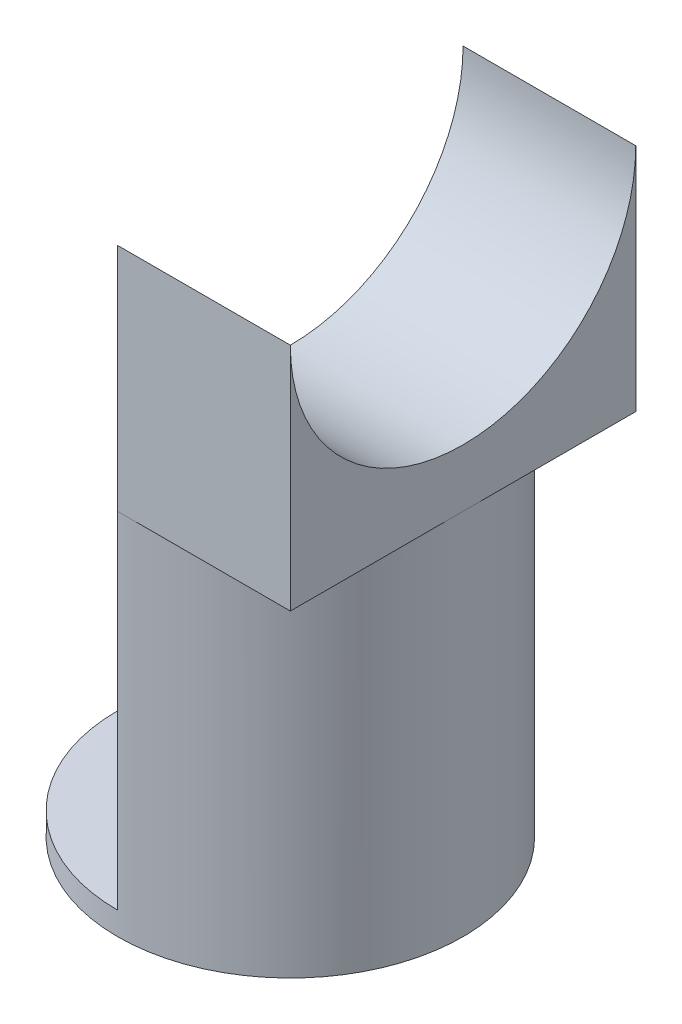
ISO-10303-21;
HEADER;
FILE_DESCRIPTION(('STEP AP214'),'2;1');
FILE_NAME('part.step','',(''),(''),'','','');
FILE_SCHEMA(('AUTOMOTIVE_DESIGN { 1 0 10303 214 1 1 1 1 }'));
ENDSEC;
DATA;
#1=APPLICATION_CONTEXT('core data for automotive mechanical design processes');
#2=APPLICATION_PROTOCOL_DEFINITION('international standard','automotive_design',2000,#1);
#3=PRODUCT_CONTEXT('',#1,'mechanical');
#4=PRODUCT('Part','Part','',(#3));
#5=PRODUCT_RELATED_PRODUCT_CATEGORY('part','',(#4));
#6=PRODUCT_DEFINITION_FORMATION('','',#4);
#7=PRODUCT_DEFINITION_CONTEXT('part definition',#1,'design');
#8=PRODUCT_DEFINITION('design','',#6,#7);
#9=PRODUCT_DEFINITION_SHAPE('','',#8);
#10=(LENGTH_UNIT() NAMED_UNIT(*) SI_UNIT(.MILLI.,.METRE.));
#11=(NAMED_UNIT(*) PLANE_ANGLE_UNIT() SI_UNIT($,.RADIAN.));
#12=(NAMED_UNIT(*) SI_UNIT($,.STERADIAN.) SOLID_ANGLE_UNIT());
#13=UNCERTAINTY_MEASURE_WITH_UNIT(LENGTH_MEASURE(1.E-05),#10,'distance_accuracy_value','');
#14=(GEOMETRIC_REPRESENTATION_CONTEXT(3) GLOBAL_UNCERTAINTY_ASSIGNED_CONTEXT((#13)) GLOBAL_UNIT_ASSIGNED_CONTEXT((#10,
#11,#12)) REPRESENTATION_CONTEXT('',''));
#15=CARTESIAN_POINT('',(0.,0.,0.));
#16=DIRECTION('',(0.,0.,1.));
#17=DIRECTION('',(1.,0.,0.));
#18=AXIS2_PLACEMENT_3D('',#15,#16,#17);
#19=CARTESIAN_POINT('',(0.,10.,0.));
#20=DIRECTION('',(0.,-1.,0.));
#21=DIRECTION('',(0.,0.,-1.));
#22=AXIS2_PLACEMENT_3D('',#19,#20,#21);
#23=CYLINDRICAL_SURFACE('',#22,75.);
#24=CARTESIAN_POINT('',(0.,10.,0.));
#25=DIRECTION('',(0.,1.,0.));
#26=DIRECTION('',(0.,0.,1.));
#27=AXIS2_PLACEMENT_3D('',#24,#25,#26);
#28=CIRCLE('',#27,75.);
#29=CARTESIAN_POINT('',(0.,10.,-75.));
#30=VERTEX_POINT('',#29);
#31=CARTESIAN_POINT('',(0.,10.,75.));
#32=VERTEX_POINT('',#31);
#33=EDGE_CURVE('E11',#30,#32,#28,.T.);
#34=ORIENTED_EDGE('',*,*,#33,.F.);
#35=DIRECTION('',(0.,-1.,0.));
#36=VECTOR('',#35,1.);
#37=CARTESIAN_POINT('',(0.,160.,-75.));
#38=LINE('',#37,#36);
#39=CARTESIAN_POINT('',(0.,160.,-75.));
#40=VERTEX_POINT('',#39);
#41=EDGE_CURVE('E125',#40,#30,#38,.T.);
#42=ORIENTED_EDGE('',*,*,#41,.F.);
#43=CARTESIAN_POINT('',(0.,160.,0.));
#44=DIRECTION('',(0.,1.,0.));
#45=DIRECTION('',(0.,0.,1.));
#46=AXIS2_PLACEMENT_3D('',#43,#44,#45);
#47=CIRCLE('',#46,75.);
#48=CARTESIAN_POINT('',(75.,160.,0.));
#49=VERTEX_POINT('',#48);
#50=EDGE_CURVE('E49',#49,#40,#47,.T.);
#51=ORIENTED_EDGE('',*,*,#50,.F.);
#52=CARTESIAN_POINT('',(0.,160.,75.));
#53=VERTEX_POINT('',#52);
#54=EDGE_CURVE('E119',#53,#49,#47,.T.);
#55=ORIENTED_EDGE('',*,*,#54,.F.);
#56=DIRECTION('',(0.,-1.,0.));
#57=VECTOR('',#56,1.);
#58=CARTESIAN_POINT('',(0.,160.,75.));
#59=LINE('',#58,#57);
#60=EDGE_CURVE('E121',#53,#32,#59,.T.);
#61=ORIENTED_EDGE('',*,*,#60,.T.);
#62=EDGE_LOOP('',(#34,#42,#51,#55,#61));
#63=FACE_BOUND('',#62,.T.);
#64=CARTESIAN_POINT('',(0.,0.,0.));
#65=DIRECTION('',(0.,1.,0.));
#66=DIRECTION('',(0.,0.,1.));
#67=AXIS2_PLACEMENT_3D('',#64,#65,#66);
#68=CIRCLE('',#67,75.);
#69=CARTESIAN_POINT('',(0.,0.,75.));
#70=VERTEX_POINT('',#69);
#71=EDGE_CURVE('E38',#70,#70,#68,.T.);
#72=ORIENTED_EDGE('',*,*,#71,.T.);
#73=EDGE_LOOP('',(#72));
#74=FACE_BOUND('',#73,.T.);
#75=ADVANCED_FACE('F35',(#63,#74),#23,.T.);
#76=CARTESIAN_POINT('',(0.,10.,0.));
#77=DIRECTION('',(0.,1.,0.));
#78=DIRECTION('',(0.,0.,1.));
#79=AXIS2_PLACEMENT_3D('',#76,#77,#78);
#80=PLANE('',#79);
#81=DIRECTION('',(0.,0.,1.));
#82=VECTOR('',#81,1.);
#83=CARTESIAN_POINT('',(0.,10.,0.));
#84=LINE('',#83,#82);
#85=EDGE_CURVE('E55',#30,#32,#84,.T.);
#86=ORIENTED_EDGE('',*,*,#85,.F.);
#87=ORIENTED_EDGE('',*,*,#33,.T.);
#88=EDGE_LOOP('',(#86,#87));
#89=FACE_BOUND('',#88,.T.);
#90=ADVANCED_FACE('F132',(#89),#80,.T.);
#91=CARTESIAN_POINT('',(0.,0.,0.));
#92=DIRECTION('',(0.,1.,0.));
#93=DIRECTION('',(0.,0.,1.));
#94=AXIS2_PLACEMENT_3D('',#91,#92,#93);
#95=PLANE('',#94);
#96=ORIENTED_EDGE('',*,*,#71,.F.);
#97=EDGE_LOOP('',(#96));
#98=FACE_BOUND('',#97,.T.);
#99=ADVANCED_FACE('F130',(#98),#95,.F.);
#100=CARTESIAN_POINT('',(0.,160.,0.));
#101=DIRECTION('',(1.,0.,0.));
#102=DIRECTION('',(0.,0.,-1.));
#103=AXIS2_PLACEMENT_3D('',#100,#101,#102);
#104=PLANE('',#103);
#105=DIRECTION('',(0.,-1.,0.));
#106=VECTOR('',#105,1.);
#107=CARTESIAN_POINT('',(0.,260.,75.));
#108=LINE('',#107,#106);
#109=CARTESIAN_POINT('',(0.,260.,75.));
#110=VERTEX_POINT('',#109);
#111=EDGE_CURVE('E103',#110,#53,#108,.T.);
#112=ORIENTED_EDGE('',*,*,#111,.F.);
#113=CARTESIAN_POINT('',(0.,260.,0.));
#114=DIRECTION('',(-1.,0.,0.));
#115=DIRECTION('',(0.,0.,1.));
#116=AXIS2_PLACEMENT_3D('',#113,#114,#115);
#117=CIRCLE('',#116,75.);
#118=CARTESIAN_POINT('',(0.,260.,-75.));
#119=VERTEX_POINT('',#118);
#120=EDGE_CURVE('E86',#119,#110,#117,.T.);
#121=ORIENTED_EDGE('',*,*,#120,.F.);
#122=DIRECTION('',(0.,-1.,0.));
#123=VECTOR('',#122,1.);
#124=CARTESIAN_POINT('',(0.,260.,-75.));
#125=LINE('',#124,#123);
#126=EDGE_CURVE('E94',#119,#40,#125,.T.);
#127=ORIENTED_EDGE('',*,*,#126,.T.);
#128=ORIENTED_EDGE('',*,*,#41,.T.);
#129=ORIENTED_EDGE('',*,*,#85,.T.);
#130=ORIENTED_EDGE('',*,*,#60,.F.);
#131=EDGE_LOOP('',(#112,#121,#127,#128,#129,#130));
#132=FACE_BOUND('',#131,.T.);
#133=ADVANCED_FACE('F100',(#132),#104,.F.);
#134=CARTESIAN_POINT('',(0.,160.,0.));
#135=DIRECTION('',(0.,1.,0.));
#136=DIRECTION('',(0.,0.,1.));
#137=AXIS2_PLACEMENT_3D('',#134,#135,#136);
#138=PLANE('',#137);
#139=DIRECTION('',(1.,0.,0.));
#140=VECTOR('',#139,1.);
#141=CARTESIAN_POINT('',(0.,160.,75.));
#142=LINE('',#141,#140);
#143=CARTESIAN_POINT('',(75.,160.,75.));
#144=VERTEX_POINT('',#143);
#145=EDGE_CURVE('E147',#53,#144,#142,.T.);
#146=ORIENTED_EDGE('',*,*,#145,.F.);
#147=ORIENTED_EDGE('',*,*,#54,.T.);
#148=DIRECTION('',(0.,0.,-1.));
#149=VECTOR('',#148,1.);
#150=CARTESIAN_POINT('',(75.,160.,-75.));
#151=LINE('',#150,#149);
#152=EDGE_CURVE('E149',#144,#49,#151,.T.);
#153=ORIENTED_EDGE('',*,*,#152,.F.);
#154=EDGE_LOOP('',(#146,#147,#153));
#155=FACE_BOUND('',#154,.T.);
#156=ADVANCED_FACE('F137',(#155),#138,.F.);
#157=CARTESIAN_POINT('',(75.,160.,-75.));
#158=VERTEX_POINT('',#157);
#159=EDGE_CURVE('E152',#49,#158,#151,.T.);
#160=ORIENTED_EDGE('',*,*,#159,.F.);
#161=ORIENTED_EDGE('',*,*,#50,.T.);
#162=DIRECTION('',(-1.,0.,0.));
#163=VECTOR('',#162,1.);
#164=CARTESIAN_POINT('',(0.,160.,-75.));
#165=LINE('',#164,#163);
#166=EDGE_CURVE('E108',#158,#40,#165,.T.);
#167=ORIENTED_EDGE('',*,*,#166,.F.);
#168=EDGE_LOOP('',(#160,#161,#167));
#169=FACE_BOUND('',#168,.T.);
#170=ADVANCED_FACE('F160',(#169),#138,.F.);
#171=CARTESIAN_POINT('',(0.,260.,75.));
#172=DIRECTION('',(0.,0.,-1.));
#173=DIRECTION('',(-1.,0.,0.));
#174=AXIS2_PLACEMENT_3D('',#171,#172,#173);
#175=PLANE('',#174);
#176=ORIENTED_EDGE('',*,*,#145,.T.);
#177=DIRECTION('',(0.,-1.,0.));
#178=VECTOR('',#177,1.);
#179=CARTESIAN_POINT('',(75.,260.,75.));
#180=LINE('',#179,#178);
#181=CARTESIAN_POINT('',(75.,260.,75.));
#182=VERTEX_POINT('',#181);
#183=EDGE_CURVE('E111',#182,#144,#180,.T.);
#184=ORIENTED_EDGE('',*,*,#183,.F.);
#185=DIRECTION('',(1.,0.,0.));
#186=VECTOR('',#185,1.);
#187=CARTESIAN_POINT('',(0.,260.,75.));
#188=LINE('',#187,#186);
#189=EDGE_CURVE('E95',#110,#182,#188,.T.);
#190=ORIENTED_EDGE('',*,*,#189,.F.);
#191=ORIENTED_EDGE('',*,*,#111,.T.);
#192=EDGE_LOOP('',(#176,#184,#190,#191));
#193=FACE_BOUND('',#192,.T.);
#194=ADVANCED_FACE('F154',(#193),#175,.F.);
#195=CARTESIAN_POINT('',(75.,260.,-75.));
#196=DIRECTION('',(-1.,0.,0.));
#197=DIRECTION('',(0.,0.,1.));
#198=AXIS2_PLACEMENT_3D('',#195,#196,#197);
#199=PLANE('',#198);
#200=DIRECTION('',(0.,-1.,0.));
#201=VECTOR('',#200,1.);
#202=CARTESIAN_POINT('',(75.,260.,-75.));
#203=LINE('',#202,#201);
#204=CARTESIAN_POINT('',(75.,260.,-75.));
#205=VERTEX_POINT('',#204);
#206=EDGE_CURVE('E109',#205,#158,#203,.T.);
#207=ORIENTED_EDGE('',*,*,#206,.F.);
#208=CARTESIAN_POINT('',(75.,260.,0.));
#209=DIRECTION('',(-1.,0.,0.));
#210=DIRECTION('',(0.,0.,1.));
#211=AXIS2_PLACEMENT_3D('',#208,#209,#210);
#212=CIRCLE('',#211,75.);
#213=EDGE_CURVE('E89',#205,#182,#212,.T.);
#214=ORIENTED_EDGE('',*,*,#213,.T.);
#215=ORIENTED_EDGE('',*,*,#183,.T.);
#216=ORIENTED_EDGE('',*,*,#152,.T.);
#217=ORIENTED_EDGE('',*,*,#159,.T.);
#218=EDGE_LOOP('',(#207,#214,#215,#216,#217));
#219=FACE_BOUND('',#218,.T.);
#220=ADVANCED_FACE('F158',(#219),#199,.F.);
#221=CARTESIAN_POINT('',(0.,260.,-75.));
#222=DIRECTION('',(0.,0.,1.));
#223=DIRECTION('',(1.,0.,0.));
#224=AXIS2_PLACEMENT_3D('',#221,#222,#223);
#225=PLANE('',#224);
#226=ORIENTED_EDGE('',*,*,#166,.T.);
#227=ORIENTED_EDGE('',*,*,#126,.F.);
#228=DIRECTION('',(-1.,0.,0.));
#229=VECTOR('',#228,1.);
#230=CARTESIAN_POINT('',(0.,260.,-75.));
#231=LINE('',#230,#229);
#232=EDGE_CURVE('E83',#205,#119,#231,.T.);
#233=ORIENTED_EDGE('',*,*,#232,.F.);
#234=ORIENTED_EDGE('',*,*,#206,.T.);
#235=EDGE_LOOP('',(#226,#227,#233,#234));
#236=FACE_BOUND('',#235,.T.);
#237=ADVANCED_FACE('F106',(#236),#225,.F.);
#238=CARTESIAN_POINT('',(100.,260.,0.));
#239=DIRECTION('',(-1.,0.,0.));
#240=DIRECTION('',(0.,0.,1.));
#241=AXIS2_PLACEMENT_3D('',#238,#239,#240);
#242=CYLINDRICAL_SURFACE('',#241,75.);
#243=ORIENTED_EDGE('',*,*,#232,.T.);
#244=ORIENTED_EDGE('',*,*,#120,.T.);
#245=ORIENTED_EDGE('',*,*,#189,.T.);
#246=ORIENTED_EDGE('',*,*,#213,.F.);
#247=EDGE_LOOP('',(#243,#244,#245,#246));
#248=FACE_BOUND('',#247,.T.);
#249=ADVANCED_FACE('F85',(#248),#242,.F.);
#250=CLOSED_SHELL('',(#75,#90,#99,#133,#156,#170,#194,#220,#237,#249));
#251=MANIFOLD_SOLID_BREP('B2',#250);
#252=ADVANCED_BREP_SHAPE_REPRESENTATION('',(#18,#251),#14);
#253=SHAPE_DEFINITION_REPRESENTATION(#9,#252);
ENDSEC;
END-ISO-10303-21;
